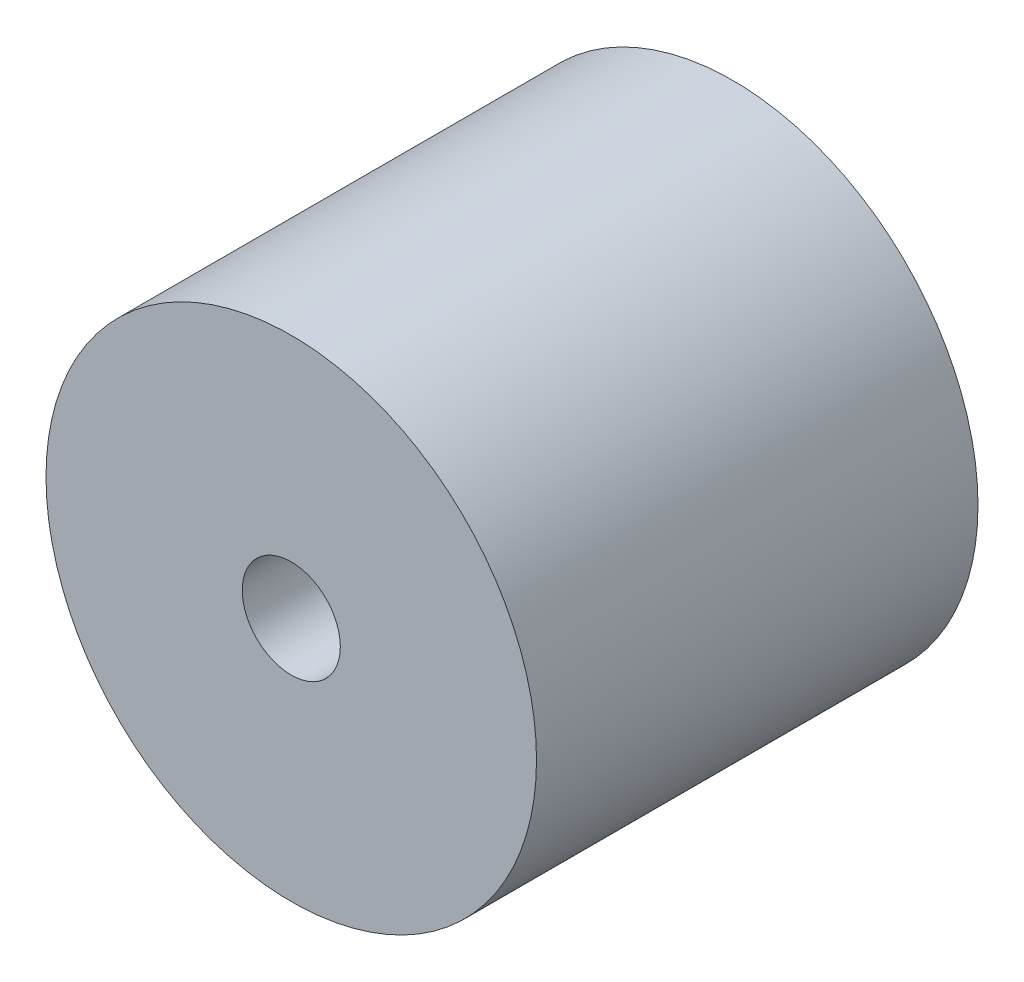
ISO-10303-21;
HEADER;
FILE_DESCRIPTION(('STEP AP214'),'2;1');
FILE_NAME('part.step','',(''),(''),'','','');
FILE_SCHEMA(('AUTOMOTIVE_DESIGN { 1 0 10303 214 1 1 1 1 }'));
ENDSEC;
DATA;
#1=APPLICATION_CONTEXT('core data for automotive mechanical design processes');
#2=APPLICATION_PROTOCOL_DEFINITION('international standard','automotive_design',2000,#1);
#3=PRODUCT_CONTEXT('',#1,'mechanical');
#4=PRODUCT('Part','Part','',(#3));
#5=PRODUCT_RELATED_PRODUCT_CATEGORY('part','',(#4));
#6=PRODUCT_DEFINITION_FORMATION('','',#4);
#7=PRODUCT_DEFINITION_CONTEXT('part definition',#1,'design');
#8=PRODUCT_DEFINITION('design','',#6,#7);
#9=PRODUCT_DEFINITION_SHAPE('','',#8);
#10=(LENGTH_UNIT() NAMED_UNIT(*) SI_UNIT(.MILLI.,.METRE.));
#11=(NAMED_UNIT(*) PLANE_ANGLE_UNIT() SI_UNIT($,.RADIAN.));
#12=(NAMED_UNIT(*) SI_UNIT($,.STERADIAN.) SOLID_ANGLE_UNIT());
#13=UNCERTAINTY_MEASURE_WITH_UNIT(LENGTH_MEASURE(1.E-05),#10,'distance_accuracy_value','');
#14=(GEOMETRIC_REPRESENTATION_CONTEXT(3) GLOBAL_UNCERTAINTY_ASSIGNED_CONTEXT((#13)) GLOBAL_UNIT_ASSIGNED_CONTEXT((#10,
#11,#12)) REPRESENTATION_CONTEXT('',''));
#15=CARTESIAN_POINT('',(0.,0.,0.));
#16=DIRECTION('',(0.,0.,1.));
#17=DIRECTION('',(1.,0.,0.));
#18=AXIS2_PLACEMENT_3D('',#15,#16,#17);
#19=CARTESIAN_POINT('',(0.,0.,27.));
#20=DIRECTION('',(0.,0.,1.));
#21=DIRECTION('',(1.,0.,0.));
#22=AXIS2_PLACEMENT_3D('',#19,#20,#21);
#23=PLANE('',#22);
#24=CARTESIAN_POINT('',(0.,0.,27.));
#25=DIRECTION('',(0.,0.,1.));
#26=DIRECTION('',(1.,0.,0.));
#27=AXIS2_PLACEMENT_3D('',#24,#25,#26);
#28=CIRCLE('',#27,15.);
#29=CARTESIAN_POINT('',(15.,0.,27.));
#30=VERTEX_POINT('',#29);
#31=EDGE_CURVE('E10',#30,#30,#28,.T.);
#32=ORIENTED_EDGE('',*,*,#31,.T.);
#33=EDGE_LOOP('',(#32));
#34=FACE_BOUND('',#33,.T.);
#35=CARTESIAN_POINT('',(0.,0.,27.));
#36=DIRECTION('',(0.,0.,1.));
#37=DIRECTION('',(1.,0.,0.));
#38=AXIS2_PLACEMENT_3D('',#35,#36,#37);
#39=CIRCLE('',#38,3.);
#40=CARTESIAN_POINT('',(3.,0.,27.));
#41=VERTEX_POINT('',#40);
#42=EDGE_CURVE('E50',#41,#41,#39,.T.);
#43=ORIENTED_EDGE('',*,*,#42,.F.);
#44=EDGE_LOOP('',(#43));
#45=FACE_BOUND('',#44,.T.);
#46=ADVANCED_FACE('F37',(#34,#45),#23,.T.);
#47=CARTESIAN_POINT('',(0.,0.,0.));
#48=DIRECTION('',(0.,0.,1.));
#49=DIRECTION('',(1.,0.,0.));
#50=AXIS2_PLACEMENT_3D('',#47,#48,#49);
#51=PLANE('',#50);
#52=CARTESIAN_POINT('',(0.,0.,0.));
#53=DIRECTION('',(0.,0.,1.));
#54=DIRECTION('',(1.,0.,0.));
#55=AXIS2_PLACEMENT_3D('',#52,#53,#54);
#56=CIRCLE('',#55,15.);
#57=CARTESIAN_POINT('',(15.,0.,0.));
#58=VERTEX_POINT('',#57);
#59=EDGE_CURVE('E41',#58,#58,#56,.T.);
#60=ORIENTED_EDGE('',*,*,#59,.F.);
#61=EDGE_LOOP('',(#60));
#62=FACE_BOUND('',#61,.T.);
#63=CARTESIAN_POINT('',(0.,0.,0.));
#64=DIRECTION('',(0.,0.,1.));
#65=DIRECTION('',(1.,0.,0.));
#66=AXIS2_PLACEMENT_3D('',#63,#64,#65);
#67=CIRCLE('',#66,3.);
#68=CARTESIAN_POINT('',(3.,0.,0.));
#69=VERTEX_POINT('',#68);
#70=EDGE_CURVE('E52',#69,#69,#67,.T.);
#71=ORIENTED_EDGE('',*,*,#70,.T.);
#72=EDGE_LOOP('',(#71));
#73=FACE_BOUND('',#72,.T.);
#74=ADVANCED_FACE('F64',(#62,#73),#51,.F.);
#75=CARTESIAN_POINT('',(0.,0.,27.));
#76=DIRECTION('',(0.,0.,-1.));
#77=DIRECTION('',(-1.,0.,0.));
#78=AXIS2_PLACEMENT_3D('',#75,#76,#77);
#79=CYLINDRICAL_SURFACE('',#78,15.);
#80=ORIENTED_EDGE('',*,*,#31,.F.);
#81=EDGE_LOOP('',(#80));
#82=FACE_BOUND('',#81,.T.);
#83=ORIENTED_EDGE('',*,*,#59,.T.);
#84=EDGE_LOOP('',(#83));
#85=FACE_BOUND('',#84,.T.);
#86=ADVANCED_FACE('F39',(#82,#85),#79,.T.);
#87=CARTESIAN_POINT('',(0.,0.,27.));
#88=DIRECTION('',(0.,0.,-1.));
#89=DIRECTION('',(-1.,0.,0.));
#90=AXIS2_PLACEMENT_3D('',#87,#88,#89);
#91=CYLINDRICAL_SURFACE('',#90,3.);
#92=ORIENTED_EDGE('',*,*,#42,.T.);
#93=EDGE_LOOP('',(#92));
#94=FACE_BOUND('',#93,.T.);
#95=ORIENTED_EDGE('',*,*,#70,.F.);
#96=EDGE_LOOP('',(#95));
#97=FACE_BOUND('',#96,.T.);
#98=ADVANCED_FACE('F60',(#94,#97),#91,.F.);
#99=CLOSED_SHELL('',(#46,#74,#86,#98));
#100=MANIFOLD_SOLID_BREP('B2',#99);
#101=ADVANCED_BREP_SHAPE_REPRESENTATION('',(#18,#100),#14);
#102=SHAPE_DEFINITION_REPRESENTATION(#9,#101);
ENDSEC;
END-ISO-10303-21;
